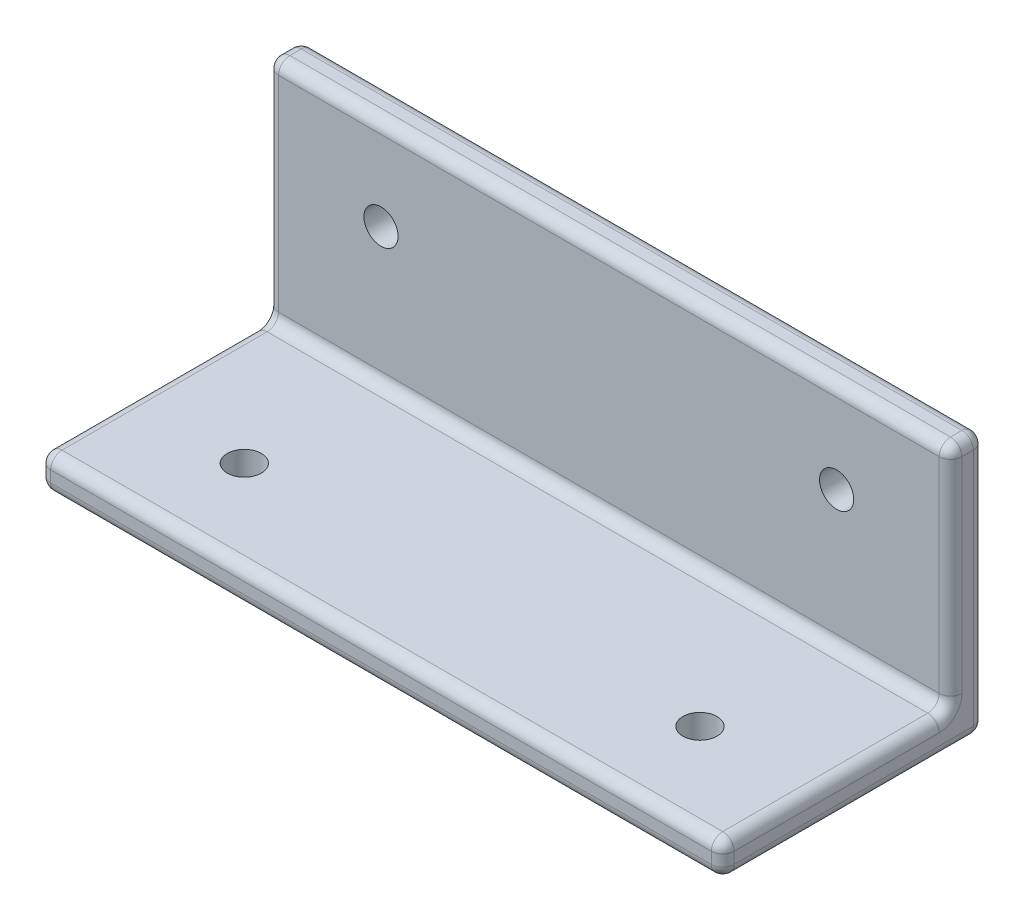
ISO-10303-21;
HEADER;
FILE_DESCRIPTION(('STEP AP214'),'2;1');
FILE_NAME('part.step','',(''),(''),'','','');
FILE_SCHEMA(('AUTOMOTIVE_DESIGN { 1 0 10303 214 1 1 1 1 }'));
ENDSEC;
DATA;
#1=APPLICATION_CONTEXT('core data for automotive mechanical design processes');
#2=APPLICATION_PROTOCOL_DEFINITION('international standard','automotive_design',2000,#1);
#3=PRODUCT_CONTEXT('',#1,'mechanical');
#4=PRODUCT('Part','Part','',(#3));
#5=PRODUCT_RELATED_PRODUCT_CATEGORY('part','',(#4));
#6=PRODUCT_DEFINITION_FORMATION('','',#4);
#7=PRODUCT_DEFINITION_CONTEXT('part definition',#1,'design');
#8=PRODUCT_DEFINITION('design','',#6,#7);
#9=PRODUCT_DEFINITION_SHAPE('','',#8);
#10=(LENGTH_UNIT() NAMED_UNIT(*) SI_UNIT(.MILLI.,.METRE.));
#11=(NAMED_UNIT(*) PLANE_ANGLE_UNIT() SI_UNIT($,.RADIAN.));
#12=(NAMED_UNIT(*) SI_UNIT($,.STERADIAN.) SOLID_ANGLE_UNIT());
#13=UNCERTAINTY_MEASURE_WITH_UNIT(LENGTH_MEASURE(1.E-05),#10,'distance_accuracy_value','');
#14=(GEOMETRIC_REPRESENTATION_CONTEXT(3) GLOBAL_UNCERTAINTY_ASSIGNED_CONTEXT((#13)) GLOBAL_UNIT_ASSIGNED_CONTEXT((#10,
#11,#12)) REPRESENTATION_CONTEXT('',''));
#15=CARTESIAN_POINT('',(0.,0.,0.));
#16=DIRECTION('',(0.,0.,1.));
#17=DIRECTION('',(1.,0.,0.));
#18=AXIS2_PLACEMENT_3D('',#15,#16,#17);
#19=CARTESIAN_POINT('',(-30.,23.,-10.));
#20=DIRECTION('',(0.,0.,-1.));
#21=DIRECTION('',(-1.,0.,0.));
#22=AXIS2_PLACEMENT_3D('',#19,#20,#21);
#23=PLANE('',#22);
#24=DIRECTION('',(1.,0.,0.));
#25=VECTOR('',#24,1.);
#26=CARTESIAN_POINT('',(-30.,22.,-10.));
#27=LINE('',#26,#25);
#28=CARTESIAN_POINT('',(29.,22.,-10.));
#29=VERTEX_POINT('',#28);
#30=CARTESIAN_POINT('',(-29.,22.,-10.));
#31=VERTEX_POINT('',#30);
#32=EDGE_CURVE('E285',#29,#31,#27,.F.);
#33=ORIENTED_EDGE('',*,*,#32,.T.);
#34=DIRECTION('',(0.,-1.,0.));
#35=VECTOR('',#34,1.);
#36=CARTESIAN_POINT('',(-29.,23.,-10.));
#37=LINE('',#36,#35);
#38=CARTESIAN_POINT('',(-29.,4.,-10.));
#39=VERTEX_POINT('',#38);
#40=EDGE_CURVE('E292',#31,#39,#37,.T.);
#41=ORIENTED_EDGE('',*,*,#40,.T.);
#42=DIRECTION('',(1.,0.,0.));
#43=VECTOR('',#42,1.);
#44=CARTESIAN_POINT('',(30.,4.,-10.));
#45=LINE('',#44,#43);
#46=CARTESIAN_POINT('',(29.,4.,-10.));
#47=VERTEX_POINT('',#46);
#48=EDGE_CURVE('E288',#39,#47,#45,.T.);
#49=ORIENTED_EDGE('',*,*,#48,.T.);
#50=DIRECTION('',(0.,-1.,0.));
#51=VECTOR('',#50,1.);
#52=CARTESIAN_POINT('',(29.,23.,-10.));
#53=LINE('',#52,#51);
#54=EDGE_CURVE('E282',#47,#29,#53,.F.);
#55=ORIENTED_EDGE('',*,*,#54,.T.);
#56=EDGE_LOOP('',(#33,#41,#49,#55));
#57=FACE_BOUND('',#56,.T.);
#58=CARTESIAN_POINT('',(20.,15.,-10.));
#59=DIRECTION('',(0.,0.,-1.));
#60=DIRECTION('',(-1.,0.,0.));
#61=AXIS2_PLACEMENT_3D('',#58,#59,#60);
#62=CIRCLE('',#61,1.5);
#63=CARTESIAN_POINT('',(18.5,15.,-10.));
#64=VERTEX_POINT('',#63);
#65=EDGE_CURVE('E879',#64,#64,#62,.T.);
#66=ORIENTED_EDGE('',*,*,#65,.T.);
#67=EDGE_LOOP('',(#66));
#68=FACE_BOUND('',#67,.T.);
#69=CARTESIAN_POINT('',(-20.,15.,-10.));
#70=DIRECTION('',(0.,0.,1.));
#71=DIRECTION('',(1.,0.,0.));
#72=AXIS2_PLACEMENT_3D('',#69,#70,#71);
#73=CIRCLE('',#72,1.5);
#74=CARTESIAN_POINT('',(-18.5,15.,-10.));
#75=VERTEX_POINT('',#74);
#76=EDGE_CURVE('E876',#75,#75,#73,.T.);
#77=ORIENTED_EDGE('',*,*,#76,.F.);
#78=EDGE_LOOP('',(#77));
#79=FACE_BOUND('',#78,.T.);
#80=ADVANCED_FACE('F45',(#57,#68,#79),#23,.F.);
#81=CARTESIAN_POINT('',(-30.,23.,-13.));
#82=DIRECTION('',(0.,0.,1.));
#83=DIRECTION('',(1.,0.,0.));
#84=AXIS2_PLACEMENT_3D('',#81,#82,#83);
#85=PLANE('',#84);
#86=DIRECTION('',(-1.,0.,0.));
#87=VECTOR('',#86,1.);
#88=CARTESIAN_POINT('',(-30.,1.,-13.));
#89=LINE('',#88,#87);
#90=CARTESIAN_POINT('',(29.,1.,-13.));
#91=VERTEX_POINT('',#90);
#92=CARTESIAN_POINT('',(-29.,1.,-13.));
#93=VERTEX_POINT('',#92);
#94=EDGE_CURVE('E249',#91,#93,#89,.T.);
#95=ORIENTED_EDGE('',*,*,#94,.T.);
#96=DIRECTION('',(0.,-1.,0.));
#97=VECTOR('',#96,1.);
#98=CARTESIAN_POINT('',(-29.,23.,-13.));
#99=LINE('',#98,#97);
#100=CARTESIAN_POINT('',(-29.,22.,-13.));
#101=VERTEX_POINT('',#100);
#102=EDGE_CURVE('E253',#93,#101,#99,.F.);
#103=ORIENTED_EDGE('',*,*,#102,.T.);
#104=DIRECTION('',(-1.,0.,0.));
#105=VECTOR('',#104,1.);
#106=CARTESIAN_POINT('',(30.,22.,-13.));
#107=LINE('',#106,#105);
#108=CARTESIAN_POINT('',(29.,22.,-13.));
#109=VERTEX_POINT('',#108);
#110=EDGE_CURVE('E246',#101,#109,#107,.F.);
#111=ORIENTED_EDGE('',*,*,#110,.T.);
#112=DIRECTION('',(0.,-1.,0.));
#113=VECTOR('',#112,1.);
#114=CARTESIAN_POINT('',(29.,0.,-13.));
#115=LINE('',#114,#113);
#116=EDGE_CURVE('E243',#109,#91,#115,.T.);
#117=ORIENTED_EDGE('',*,*,#116,.T.);
#118=EDGE_LOOP('',(#95,#103,#111,#117));
#119=FACE_BOUND('',#118,.T.);
#120=CARTESIAN_POINT('',(20.,15.,-13.));
#121=DIRECTION('',(0.,0.,-1.));
#122=DIRECTION('',(-1.,0.,0.));
#123=AXIS2_PLACEMENT_3D('',#120,#121,#122);
#124=CIRCLE('',#123,1.5);
#125=CARTESIAN_POINT('',(18.5,15.,-13.));
#126=VERTEX_POINT('',#125);
#127=EDGE_CURVE('E885',#126,#126,#124,.T.);
#128=ORIENTED_EDGE('',*,*,#127,.F.);
#129=EDGE_LOOP('',(#128));
#130=FACE_BOUND('',#129,.T.);
#131=CARTESIAN_POINT('',(-20.,15.,-13.));
#132=DIRECTION('',(0.,0.,1.));
#133=DIRECTION('',(1.,0.,0.));
#134=AXIS2_PLACEMENT_3D('',#131,#132,#133);
#135=CIRCLE('',#134,1.5);
#136=CARTESIAN_POINT('',(-18.5,15.,-13.));
#137=VERTEX_POINT('',#136);
#138=EDGE_CURVE('E873',#137,#137,#135,.T.);
#139=ORIENTED_EDGE('',*,*,#138,.T.);
#140=EDGE_LOOP('',(#139));
#141=FACE_BOUND('',#140,.T.);
#142=ADVANCED_FACE('F460',(#119,#130,#141),#85,.F.);
#143=CARTESIAN_POINT('',(0.,3.,0.));
#144=DIRECTION('',(0.,-1.,0.));
#145=DIRECTION('',(0.,0.,-1.));
#146=AXIS2_PLACEMENT_3D('',#143,#144,#145);
#147=PLANE('',#146);
#148=DIRECTION('',(1.,0.,0.));
#149=VECTOR('',#148,1.);
#150=CARTESIAN_POINT('',(0.,3.,9.00000000000001));
#151=LINE('',#150,#149);
#152=CARTESIAN_POINT('',(-29.,3.,9.00000000000001));
#153=VERTEX_POINT('',#152);
#154=CARTESIAN_POINT('',(29.,3.,9.00000000000001));
#155=VERTEX_POINT('',#154);
#156=EDGE_CURVE('E298',#153,#155,#151,.T.);
#157=ORIENTED_EDGE('',*,*,#156,.T.);
#158=DIRECTION('',(0.,0.,1.));
#159=VECTOR('',#158,1.);
#160=CARTESIAN_POINT('',(29.,3.,-10.));
#161=LINE('',#160,#159);
#162=CARTESIAN_POINT('',(29.,3.,-9.));
#163=VERTEX_POINT('',#162);
#164=EDGE_CURVE('E305',#155,#163,#161,.F.);
#165=ORIENTED_EDGE('',*,*,#164,.T.);
#166=DIRECTION('',(1.,0.,0.));
#167=VECTOR('',#166,1.);
#168=CARTESIAN_POINT('',(-30.,3.,-9.));
#169=LINE('',#168,#167);
#170=CARTESIAN_POINT('',(-29.,3.,-9.));
#171=VERTEX_POINT('',#170);
#172=EDGE_CURVE('E301',#163,#171,#169,.F.);
#173=ORIENTED_EDGE('',*,*,#172,.T.);
#174=DIRECTION('',(0.,0.,1.));
#175=VECTOR('',#174,1.);
#176=CARTESIAN_POINT('',(-29.,3.,0.));
#177=LINE('',#176,#175);
#178=EDGE_CURVE('E295',#171,#153,#177,.T.);
#179=ORIENTED_EDGE('',*,*,#178,.T.);
#180=EDGE_LOOP('',(#157,#165,#173,#179));
#181=FACE_BOUND('',#180,.T.);
#182=CARTESIAN_POINT('',(20.,3.,2.));
#183=DIRECTION('',(0.,-1.,0.));
#184=DIRECTION('',(0.,0.,-1.));
#185=AXIS2_PLACEMENT_3D('',#182,#183,#184);
#186=CIRCLE('',#185,1.5);
#187=CARTESIAN_POINT('',(20.,3.,0.500000000000002));
#188=VERTEX_POINT('',#187);
#189=EDGE_CURVE('E897',#188,#188,#186,.T.);
#190=ORIENTED_EDGE('',*,*,#189,.T.);
#191=EDGE_LOOP('',(#190));
#192=FACE_BOUND('',#191,.T.);
#193=CARTESIAN_POINT('',(-20.,3.,2.));
#194=DIRECTION('',(0.,1.,0.));
#195=DIRECTION('',(0.,0.,1.));
#196=AXIS2_PLACEMENT_3D('',#193,#194,#195);
#197=CIRCLE('',#196,1.5);
#198=CARTESIAN_POINT('',(-20.,3.,3.5));
#199=VERTEX_POINT('',#198);
#200=EDGE_CURVE('E894',#199,#199,#197,.T.);
#201=ORIENTED_EDGE('',*,*,#200,.F.);
#202=EDGE_LOOP('',(#201));
#203=FACE_BOUND('',#202,.T.);
#204=ADVANCED_FACE('F485',(#181,#192,#203),#147,.F.);
#205=CARTESIAN_POINT('',(0.,0.,0.));
#206=DIRECTION('',(0.,-1.,0.));
#207=DIRECTION('',(0.,0.,-1.));
#208=AXIS2_PLACEMENT_3D('',#205,#206,#207);
#209=PLANE('',#208);
#210=CARTESIAN_POINT('',(20.,0.,2.));
#211=DIRECTION('',(0.,-1.,0.));
#212=DIRECTION('',(0.,0.,-1.));
#213=AXIS2_PLACEMENT_3D('',#210,#211,#212);
#214=CIRCLE('',#213,1.5);
#215=CARTESIAN_POINT('',(20.,0.,0.500000000000002));
#216=VERTEX_POINT('',#215);
#217=EDGE_CURVE('E213',#216,#216,#214,.T.);
#218=ORIENTED_EDGE('',*,*,#217,.F.);
#219=EDGE_LOOP('',(#218));
#220=FACE_BOUND('',#219,.T.);
#221=DIRECTION('',(0.,0.,1.));
#222=VECTOR('',#221,1.);
#223=CARTESIAN_POINT('',(-29.,0.,-13.));
#224=LINE('',#223,#222);
#225=CARTESIAN_POINT('',(-29.,0.,9.00000000000001));
#226=VERTEX_POINT('',#225);
#227=CARTESIAN_POINT('',(-29.,0.,-12.));
#228=VERTEX_POINT('',#227);
#229=EDGE_CURVE('E262',#226,#228,#224,.F.);
#230=ORIENTED_EDGE('',*,*,#229,.T.);
#231=DIRECTION('',(-1.,0.,0.));
#232=VECTOR('',#231,1.);
#233=CARTESIAN_POINT('',(30.,0.,-12.));
#234=LINE('',#233,#232);
#235=CARTESIAN_POINT('',(29.,0.,-12.));
#236=VERTEX_POINT('',#235);
#237=EDGE_CURVE('E265',#228,#236,#234,.F.);
#238=ORIENTED_EDGE('',*,*,#237,.T.);
#239=DIRECTION('',(0.,0.,1.));
#240=VECTOR('',#239,1.);
#241=CARTESIAN_POINT('',(29.,0.,0.));
#242=LINE('',#241,#240);
#243=CARTESIAN_POINT('',(29.,0.,9.00000000000001));
#244=VERTEX_POINT('',#243);
#245=EDGE_CURVE('E256',#236,#244,#242,.T.);
#246=ORIENTED_EDGE('',*,*,#245,.T.);
#247=DIRECTION('',(1.,0.,0.));
#248=VECTOR('',#247,1.);
#249=CARTESIAN_POINT('',(-30.,0.,9.00000000000001));
#250=LINE('',#249,#248);
#251=EDGE_CURVE('E259',#244,#226,#250,.F.);
#252=ORIENTED_EDGE('',*,*,#251,.T.);
#253=EDGE_LOOP('',(#230,#238,#246,#252));
#254=FACE_BOUND('',#253,.T.);
#255=CARTESIAN_POINT('',(-20.,0.,2.));
#256=DIRECTION('',(0.,1.,0.));
#257=DIRECTION('',(0.,0.,1.));
#258=AXIS2_PLACEMENT_3D('',#255,#256,#257);
#259=CIRCLE('',#258,1.5);
#260=CARTESIAN_POINT('',(-20.,0.,3.5));
#261=VERTEX_POINT('',#260);
#262=EDGE_CURVE('E329',#261,#261,#259,.T.);
#263=ORIENTED_EDGE('',*,*,#262,.T.);
#264=EDGE_LOOP('',(#263));
#265=FACE_BOUND('',#264,.T.);
#266=ADVANCED_FACE('F494',(#220,#254,#265),#209,.T.);
#267=CARTESIAN_POINT('',(-30.,3.,-10.));
#268=DIRECTION('',(1.,0.,0.));
#269=DIRECTION('',(0.,0.,-1.));
#270=AXIS2_PLACEMENT_3D('',#267,#268,#269);
#271=PLANE('',#270);
#272=DIRECTION('',(0.,-1.,0.));
#273=VECTOR('',#272,1.);
#274=CARTESIAN_POINT('',(-30.,3.,-11.));
#275=LINE('',#274,#273);
#276=CARTESIAN_POINT('',(-30.,4.,-11.));
#277=VERTEX_POINT('',#276);
#278=CARTESIAN_POINT('',(-30.,22.,-11.));
#279=VERTEX_POINT('',#278);
#280=EDGE_CURVE('E69',#277,#279,#275,.F.);
#281=ORIENTED_EDGE('',*,*,#280,.T.);
#282=DIRECTION('',(0.,0.,1.));
#283=VECTOR('',#282,1.);
#284=CARTESIAN_POINT('',(-30.,22.,-13.));
#285=LINE('',#284,#283);
#286=CARTESIAN_POINT('',(-30.,22.,-12.));
#287=VERTEX_POINT('',#286);
#288=EDGE_CURVE('E11',#279,#287,#285,.F.);
#289=ORIENTED_EDGE('',*,*,#288,.T.);
#290=DIRECTION('',(0.,-1.,0.));
#291=VECTOR('',#290,1.);
#292=CARTESIAN_POINT('',(-30.,3.,-12.));
#293=LINE('',#292,#291);
#294=CARTESIAN_POINT('',(-30.,1.,-12.));
#295=VERTEX_POINT('',#294);
#296=EDGE_CURVE('E55',#287,#295,#293,.T.);
#297=ORIENTED_EDGE('',*,*,#296,.T.);
#298=DIRECTION('',(0.,0.,1.));
#299=VECTOR('',#298,1.);
#300=CARTESIAN_POINT('',(-30.,1.,10.));
#301=LINE('',#300,#299);
#302=CARTESIAN_POINT('',(-30.,1.,9.00000000000001));
#303=VERTEX_POINT('',#302);
#304=EDGE_CURVE('E318',#295,#303,#301,.T.);
#305=ORIENTED_EDGE('',*,*,#304,.T.);
#306=DIRECTION('',(0.,-1.,0.));
#307=VECTOR('',#306,1.);
#308=CARTESIAN_POINT('',(-30.,3.,9.00000000000001));
#309=LINE('',#308,#307);
#310=CARTESIAN_POINT('',(-30.,2.,9.00000000000001));
#311=VERTEX_POINT('',#310);
#312=EDGE_CURVE('E315',#303,#311,#309,.F.);
#313=ORIENTED_EDGE('',*,*,#312,.T.);
#314=DIRECTION('',(0.,0.,1.));
#315=VECTOR('',#314,1.);
#316=CARTESIAN_POINT('',(-30.,2.,-10.));
#317=LINE('',#316,#315);
#318=CARTESIAN_POINT('',(-30.,2.,-9.));
#319=VERTEX_POINT('',#318);
#320=EDGE_CURVE('E312',#311,#319,#317,.F.);
#321=ORIENTED_EDGE('',*,*,#320,.T.);
#322=CARTESIAN_POINT('',(-30.,4.,-9.));
#323=DIRECTION('',(1.,0.,0.));
#324=DIRECTION('',(0.,0.,-1.));
#325=AXIS2_PLACEMENT_3D('',#322,#323,#324);
#326=CIRCLE('',#325,2.);
#327=EDGE_CURVE('E308',#277,#319,#326,.F.);
#328=ORIENTED_EDGE('',*,*,#327,.F.);
#329=EDGE_LOOP('',(#281,#289,#297,#305,#313,#321,#328));
#330=FACE_BOUND('',#329,.T.);
#331=ADVANCED_FACE('F498',(#330),#271,.F.);
#332=CARTESIAN_POINT('',(-30.,3.,10.));
#333=DIRECTION('',(0.,0.,-1.));
#334=DIRECTION('',(-1.,0.,0.));
#335=AXIS2_PLACEMENT_3D('',#332,#333,#334);
#336=PLANE('',#335);
#337=DIRECTION('',(0.,-1.,0.));
#338=VECTOR('',#337,1.);
#339=CARTESIAN_POINT('',(29.,3.,10.));
#340=LINE('',#339,#338);
#341=CARTESIAN_POINT('',(29.,1.,10.));
#342=VERTEX_POINT('',#341);
#343=CARTESIAN_POINT('',(29.,2.,10.));
#344=VERTEX_POINT('',#343);
#345=EDGE_CURVE('E236',#342,#344,#340,.F.);
#346=ORIENTED_EDGE('',*,*,#345,.T.);
#347=DIRECTION('',(1.,0.,0.));
#348=VECTOR('',#347,1.);
#349=CARTESIAN_POINT('',(-30.,2.,10.));
#350=LINE('',#349,#348);
#351=CARTESIAN_POINT('',(-29.,2.,10.));
#352=VERTEX_POINT('',#351);
#353=EDGE_CURVE('E240',#344,#352,#350,.F.);
#354=ORIENTED_EDGE('',*,*,#353,.T.);
#355=DIRECTION('',(0.,-1.,0.));
#356=VECTOR('',#355,1.);
#357=CARTESIAN_POINT('',(-29.,3.,10.));
#358=LINE('',#357,#356);
#359=CARTESIAN_POINT('',(-29.,1.,10.));
#360=VERTEX_POINT('',#359);
#361=EDGE_CURVE('E233',#352,#360,#358,.T.);
#362=ORIENTED_EDGE('',*,*,#361,.T.);
#363=DIRECTION('',(1.,0.,0.));
#364=VECTOR('',#363,1.);
#365=CARTESIAN_POINT('',(30.,1.,10.));
#366=LINE('',#365,#364);
#367=EDGE_CURVE('E230',#360,#342,#366,.T.);
#368=ORIENTED_EDGE('',*,*,#367,.T.);
#369=EDGE_LOOP('',(#346,#354,#362,#368));
#370=FACE_BOUND('',#369,.T.);
#371=ADVANCED_FACE('F502',(#370),#336,.F.);
#372=CARTESIAN_POINT('',(30.,3.,-10.));
#373=DIRECTION('',(1.,0.,0.));
#374=DIRECTION('',(0.,0.,-1.));
#375=AXIS2_PLACEMENT_3D('',#372,#373,#374);
#376=PLANE('',#375);
#377=DIRECTION('',(0.,-1.,0.));
#378=VECTOR('',#377,1.);
#379=CARTESIAN_POINT('',(30.,0.,9.00000000000001));
#380=LINE('',#379,#378);
#381=CARTESIAN_POINT('',(30.,2.,9.00000000000001));
#382=VERTEX_POINT('',#381);
#383=CARTESIAN_POINT('',(30.,1.,9.00000000000001));
#384=VERTEX_POINT('',#383);
#385=EDGE_CURVE('E221',#382,#384,#380,.T.);
#386=ORIENTED_EDGE('',*,*,#385,.T.);
#387=DIRECTION('',(0.,0.,1.));
#388=VECTOR('',#387,1.);
#389=CARTESIAN_POINT('',(30.,1.,-10.));
#390=LINE('',#389,#388);
#391=CARTESIAN_POINT('',(30.,1.,-12.));
#392=VERTEX_POINT('',#391);
#393=EDGE_CURVE('E227',#384,#392,#390,.F.);
#394=ORIENTED_EDGE('',*,*,#393,.T.);
#395=DIRECTION('',(0.,-1.,0.));
#396=VECTOR('',#395,1.);
#397=CARTESIAN_POINT('',(30.,23.,-12.));
#398=LINE('',#397,#396);
#399=CARTESIAN_POINT('',(30.,22.,-12.));
#400=VERTEX_POINT('',#399);
#401=EDGE_CURVE('E224',#392,#400,#398,.F.);
#402=ORIENTED_EDGE('',*,*,#401,.T.);
#403=DIRECTION('',(0.,0.,-1.));
#404=VECTOR('',#403,1.);
#405=CARTESIAN_POINT('',(30.,22.,-10.));
#406=LINE('',#405,#404);
#407=CARTESIAN_POINT('',(30.,22.,-11.));
#408=VERTEX_POINT('',#407);
#409=EDGE_CURVE('E218',#400,#408,#406,.F.);
#410=ORIENTED_EDGE('',*,*,#409,.T.);
#411=DIRECTION('',(0.,-1.,0.));
#412=VECTOR('',#411,1.);
#413=CARTESIAN_POINT('',(30.,3.,-11.));
#414=LINE('',#413,#412);
#415=CARTESIAN_POINT('',(30.,4.,-11.));
#416=VERTEX_POINT('',#415);
#417=EDGE_CURVE('E186',#408,#416,#414,.T.);
#418=ORIENTED_EDGE('',*,*,#417,.T.);
#419=CARTESIAN_POINT('',(30.,4.,-9.));
#420=DIRECTION('',(1.,0.,0.));
#421=DIRECTION('',(0.,0.,-1.));
#422=AXIS2_PLACEMENT_3D('',#419,#420,#421);
#423=CIRCLE('',#422,2.);
#424=CARTESIAN_POINT('',(30.,2.,-9.));
#425=VERTEX_POINT('',#424);
#426=EDGE_CURVE('E178',#425,#416,#423,.T.);
#427=ORIENTED_EDGE('',*,*,#426,.F.);
#428=DIRECTION('',(0.,0.,1.));
#429=VECTOR('',#428,1.);
#430=CARTESIAN_POINT('',(30.,2.,10.));
#431=LINE('',#430,#429);
#432=EDGE_CURVE('E183',#425,#382,#431,.T.);
#433=ORIENTED_EDGE('',*,*,#432,.T.);
#434=EDGE_LOOP('',(#386,#394,#402,#410,#418,#427,#433));
#435=FACE_BOUND('',#434,.T.);
#436=ADVANCED_FACE('F181',(#435),#376,.T.);
#437=CARTESIAN_POINT('',(0.,23.,0.));
#438=DIRECTION('',(0.,1.,0.));
#439=DIRECTION('',(0.,0.,1.));
#440=AXIS2_PLACEMENT_3D('',#437,#438,#439);
#441=PLANE('',#440);
#442=DIRECTION('',(0.,0.,1.));
#443=VECTOR('',#442,1.);
#444=CARTESIAN_POINT('',(-29.,23.,-10.));
#445=LINE('',#444,#443);
#446=CARTESIAN_POINT('',(-29.,23.,-12.));
#447=VERTEX_POINT('',#446);
#448=CARTESIAN_POINT('',(-29.,23.,-11.));
#449=VERTEX_POINT('',#448);
#450=EDGE_CURVE('E272',#447,#449,#445,.T.);
#451=ORIENTED_EDGE('',*,*,#450,.T.);
#452=DIRECTION('',(1.,0.,0.));
#453=VECTOR('',#452,1.);
#454=CARTESIAN_POINT('',(30.,23.,-11.));
#455=LINE('',#454,#453);
#456=CARTESIAN_POINT('',(29.,23.,-11.));
#457=VERTEX_POINT('',#456);
#458=EDGE_CURVE('E279',#449,#457,#455,.T.);
#459=ORIENTED_EDGE('',*,*,#458,.T.);
#460=DIRECTION('',(0.,0.,-1.));
#461=VECTOR('',#460,1.);
#462=CARTESIAN_POINT('',(29.,23.,0.));
#463=LINE('',#462,#461);
#464=CARTESIAN_POINT('',(29.,23.,-12.));
#465=VERTEX_POINT('',#464);
#466=EDGE_CURVE('E275',#457,#465,#463,.T.);
#467=ORIENTED_EDGE('',*,*,#466,.T.);
#468=DIRECTION('',(-1.,0.,0.));
#469=VECTOR('',#468,1.);
#470=CARTESIAN_POINT('',(-30.,23.,-12.));
#471=LINE('',#470,#469);
#472=EDGE_CURVE('E269',#465,#447,#471,.T.);
#473=ORIENTED_EDGE('',*,*,#472,.T.);
#474=EDGE_LOOP('',(#451,#459,#467,#473));
#475=FACE_BOUND('',#474,.T.);
#476=ADVANCED_FACE('F489',(#475),#441,.T.);
#477=CARTESIAN_POINT('',(-29.,22.,0.));
#478=DIRECTION('',(0.,0.,-1.));
#479=DIRECTION('',(-1.,0.,0.));
#480=AXIS2_PLACEMENT_3D('',#477,#478,#479);
#481=CYLINDRICAL_SURFACE('',#480,1.);
#482=CARTESIAN_POINT('',(-29.,22.,-11.));
#483=DIRECTION('',(0.,0.,1.));
#484=DIRECTION('',(1.,0.,0.));
#485=AXIS2_PLACEMENT_3D('',#482,#483,#484);
#486=CIRCLE('',#485,1.);
#487=EDGE_CURVE('E49',#449,#279,#486,.T.);
#488=ORIENTED_EDGE('',*,*,#487,.F.);
#489=ORIENTED_EDGE('',*,*,#450,.F.);
#490=CARTESIAN_POINT('',(-29.,22.,-12.));
#491=DIRECTION('',(0.,0.,-1.));
#492=DIRECTION('',(-1.,0.,0.));
#493=AXIS2_PLACEMENT_3D('',#490,#491,#492);
#494=CIRCLE('',#493,1.);
#495=EDGE_CURVE('E211',#287,#447,#494,.T.);
#496=ORIENTED_EDGE('',*,*,#495,.F.);
#497=ORIENTED_EDGE('',*,*,#288,.F.);
#498=EDGE_LOOP('',(#488,#489,#496,#497));
#499=FACE_BOUND('',#498,.T.);
#500=ADVANCED_FACE('F47',(#499),#481,.T.);
#501=CARTESIAN_POINT('',(-29.,22.,-11.));
#502=DIRECTION('',(-1.,0.,0.));
#503=DIRECTION('',(0.,0.,1.));
#504=AXIS2_PLACEMENT_3D('',#501,#502,#503);
#505=SPHERICAL_SURFACE('',#504,1.);
#506=CARTESIAN_POINT('',(-29.,22.,-11.));
#507=DIRECTION('',(-1.,0.,0.));
#508=DIRECTION('',(0.,0.,1.));
#509=AXIS2_PLACEMENT_3D('',#506,#507,#508);
#510=CIRCLE('',#509,1.);
#511=EDGE_CURVE('E438',#449,#31,#510,.F.);
#512=ORIENTED_EDGE('',*,*,#511,.F.);
#513=ORIENTED_EDGE('',*,*,#487,.T.);
#514=CARTESIAN_POINT('',(-29.,22.,-11.));
#515=DIRECTION('',(0.,1.,0.));
#516=DIRECTION('',(0.,0.,1.));
#517=AXIS2_PLACEMENT_3D('',#514,#515,#516);
#518=CIRCLE('',#517,1.);
#519=EDGE_CURVE('E442',#31,#279,#518,.F.);
#520=ORIENTED_EDGE('',*,*,#519,.F.);
#521=EDGE_LOOP('',(#512,#513,#520));
#522=FACE_BOUND('',#521,.T.);
#523=ADVANCED_FACE('F645',(#522),#505,.T.);
#524=CARTESIAN_POINT('',(-29.,22.,-12.));
#525=DIRECTION('',(0.,1.,0.));
#526=DIRECTION('',(0.,0.,1.));
#527=AXIS2_PLACEMENT_3D('',#524,#525,#526);
#528=SPHERICAL_SURFACE('',#527,1.);
#529=CARTESIAN_POINT('',(-29.,22.,-12.));
#530=DIRECTION('',(0.,1.,0.));
#531=DIRECTION('',(0.,0.,1.));
#532=AXIS2_PLACEMENT_3D('',#529,#530,#531);
#533=CIRCLE('',#532,1.);
#534=EDGE_CURVE('E431',#287,#101,#533,.F.);
#535=ORIENTED_EDGE('',*,*,#534,.F.);
#536=ORIENTED_EDGE('',*,*,#495,.T.);
#537=CARTESIAN_POINT('',(-29.,22.,-12.));
#538=DIRECTION('',(-1.,0.,0.));
#539=DIRECTION('',(0.,0.,1.));
#540=AXIS2_PLACEMENT_3D('',#537,#538,#539);
#541=CIRCLE('',#540,1.);
#542=EDGE_CURVE('E434',#101,#447,#541,.F.);
#543=ORIENTED_EDGE('',*,*,#542,.F.);
#544=EDGE_LOOP('',(#535,#536,#543));
#545=FACE_BOUND('',#544,.T.);
#546=ADVANCED_FACE('F450',(#545),#528,.T.);
#547=CARTESIAN_POINT('',(-29.,23.,-11.));
#548=DIRECTION('',(0.,-1.,0.));
#549=DIRECTION('',(0.,0.,-1.));
#550=AXIS2_PLACEMENT_3D('',#547,#548,#549);
#551=CYLINDRICAL_SURFACE('',#550,1.);
#552=ORIENTED_EDGE('',*,*,#519,.T.);
#553=ORIENTED_EDGE('',*,*,#280,.F.);
#554=CARTESIAN_POINT('',(-29.,4.,-11.));
#555=DIRECTION('',(0.,-1.,0.));
#556=DIRECTION('',(0.,0.,-1.));
#557=AXIS2_PLACEMENT_3D('',#554,#555,#556);
#558=CIRCLE('',#557,1.);
#559=EDGE_CURVE('E427',#39,#277,#558,.T.);
#560=ORIENTED_EDGE('',*,*,#559,.F.);
#561=ORIENTED_EDGE('',*,*,#40,.F.);
#562=EDGE_LOOP('',(#552,#553,#560,#561));
#563=FACE_BOUND('',#562,.T.);
#564=ADVANCED_FACE('F643',(#563),#551,.T.);
#565=CARTESIAN_POINT('',(0.,22.,-11.));
#566=DIRECTION('',(-1.,0.,0.));
#567=DIRECTION('',(0.,0.,1.));
#568=AXIS2_PLACEMENT_3D('',#565,#566,#567);
#569=CYLINDRICAL_SURFACE('',#568,1.);
#570=ORIENTED_EDGE('',*,*,#511,.T.);
#571=ORIENTED_EDGE('',*,*,#32,.F.);
#572=CARTESIAN_POINT('',(29.,22.,-11.));
#573=DIRECTION('',(1.,0.,0.));
#574=DIRECTION('',(0.,0.,-1.));
#575=AXIS2_PLACEMENT_3D('',#572,#573,#574);
#576=CIRCLE('',#575,1.);
#577=EDGE_CURVE('E423',#457,#29,#576,.T.);
#578=ORIENTED_EDGE('',*,*,#577,.F.);
#579=ORIENTED_EDGE('',*,*,#458,.F.);
#580=EDGE_LOOP('',(#570,#571,#578,#579));
#581=FACE_BOUND('',#580,.T.);
#582=ADVANCED_FACE('F600',(#581),#569,.T.);
#583=CARTESIAN_POINT('',(29.,22.,0.));
#584=DIRECTION('',(0.,0.,-1.));
#585=DIRECTION('',(-1.,0.,0.));
#586=AXIS2_PLACEMENT_3D('',#583,#584,#585);
#587=CYLINDRICAL_SURFACE('',#586,1.);
#588=CARTESIAN_POINT('',(29.,22.,-12.));
#589=DIRECTION('',(0.,0.,-1.));
#590=DIRECTION('',(-1.,0.,0.));
#591=AXIS2_PLACEMENT_3D('',#588,#589,#590);
#592=CIRCLE('',#591,1.);
#593=EDGE_CURVE('E415',#465,#400,#592,.T.);
#594=ORIENTED_EDGE('',*,*,#593,.F.);
#595=ORIENTED_EDGE('',*,*,#466,.F.);
#596=CARTESIAN_POINT('',(29.,22.,-11.));
#597=DIRECTION('',(0.,0.,1.));
#598=DIRECTION('',(1.,0.,0.));
#599=AXIS2_PLACEMENT_3D('',#596,#597,#598);
#600=CIRCLE('',#599,1.);
#601=EDGE_CURVE('E419',#408,#457,#600,.T.);
#602=ORIENTED_EDGE('',*,*,#601,.F.);
#603=ORIENTED_EDGE('',*,*,#409,.F.);
#604=EDGE_LOOP('',(#594,#595,#602,#603));
#605=FACE_BOUND('',#604,.T.);
#606=ADVANCED_FACE('F476',(#605),#587,.T.);
#607=CARTESIAN_POINT('',(0.,22.,-12.));
#608=DIRECTION('',(1.,0.,0.));
#609=DIRECTION('',(0.,0.,-1.));
#610=AXIS2_PLACEMENT_3D('',#607,#608,#609);
#611=CYLINDRICAL_SURFACE('',#610,1.);
#612=ORIENTED_EDGE('',*,*,#542,.T.);
#613=ORIENTED_EDGE('',*,*,#472,.F.);
#614=CARTESIAN_POINT('',(29.,22.,-12.));
#615=DIRECTION('',(1.,0.,0.));
#616=DIRECTION('',(0.,1.,0.));
#617=AXIS2_PLACEMENT_3D('',#614,#615,#616);
#618=CIRCLE('',#617,1.);
#619=EDGE_CURVE('E412',#109,#465,#618,.T.);
#620=ORIENTED_EDGE('',*,*,#619,.F.);
#621=ORIENTED_EDGE('',*,*,#110,.F.);
#622=EDGE_LOOP('',(#612,#613,#620,#621));
#623=FACE_BOUND('',#622,.T.);
#624=ADVANCED_FACE('F456',(#623),#611,.T.);
#625=CARTESIAN_POINT('',(-29.,3.,-12.));
#626=DIRECTION('',(0.,-1.,0.));
#627=DIRECTION('',(0.,0.,-1.));
#628=AXIS2_PLACEMENT_3D('',#625,#626,#627);
#629=CYLINDRICAL_SURFACE('',#628,1.);
#630=ORIENTED_EDGE('',*,*,#534,.T.);
#631=ORIENTED_EDGE('',*,*,#102,.F.);
#632=CARTESIAN_POINT('',(-29.,1.,-12.));
#633=DIRECTION('',(0.,-1.,0.));
#634=DIRECTION('',(0.,0.,-1.));
#635=AXIS2_PLACEMENT_3D('',#632,#633,#634);
#636=CIRCLE('',#635,1.);
#637=EDGE_CURVE('E408',#295,#93,#636,.T.);
#638=ORIENTED_EDGE('',*,*,#637,.F.);
#639=ORIENTED_EDGE('',*,*,#296,.F.);
#640=EDGE_LOOP('',(#630,#631,#638,#639));
#641=FACE_BOUND('',#640,.T.);
#642=ADVANCED_FACE('F465',(#641),#629,.T.);
#643=CARTESIAN_POINT('',(-29.,4.,-9.));
#644=DIRECTION('',(1.,0.,0.));
#645=DIRECTION('',(0.,0.,-1.));
#646=AXIS2_PLACEMENT_3D('',#643,#644,#645);
#647=TOROIDAL_SURFACE('',#646,2.,1.);
#648=ORIENTED_EDGE('',*,*,#559,.T.);
#649=ORIENTED_EDGE('',*,*,#327,.T.);
#650=CARTESIAN_POINT('',(-29.,2.,-9.));
#651=DIRECTION('',(0.,0.,-1.));
#652=DIRECTION('',(-1.,0.,0.));
#653=AXIS2_PLACEMENT_3D('',#650,#651,#652);
#654=CIRCLE('',#653,1.);
#655=EDGE_CURVE('E404',#171,#319,#654,.F.);
#656=ORIENTED_EDGE('',*,*,#655,.F.);
#657=CARTESIAN_POINT('',(-29.,4.,-9.));
#658=DIRECTION('',(1.,0.,0.));
#659=DIRECTION('',(0.,0.,-1.));
#660=AXIS2_PLACEMENT_3D('',#657,#658,#659);
#661=CIRCLE('',#660,1.);
#662=EDGE_CURVE('E400',#39,#171,#661,.F.);
#663=ORIENTED_EDGE('',*,*,#662,.F.);
#664=EDGE_LOOP('',(#648,#649,#656,#663));
#665=FACE_BOUND('',#664,.T.);
#666=ADVANCED_FACE('F467',(#665),#647,.T.);
#667=CARTESIAN_POINT('',(29.,22.,-11.));
#668=DIRECTION('',(0.,1.,0.));
#669=DIRECTION('',(0.,0.,1.));
#670=AXIS2_PLACEMENT_3D('',#667,#668,#669);
#671=SPHERICAL_SURFACE('',#670,1.);
#672=ORIENTED_EDGE('',*,*,#601,.T.);
#673=ORIENTED_EDGE('',*,*,#577,.T.);
#674=CARTESIAN_POINT('',(29.,22.,-11.));
#675=DIRECTION('',(0.,1.,0.));
#676=DIRECTION('',(0.,0.,1.));
#677=AXIS2_PLACEMENT_3D('',#674,#675,#676);
#678=CIRCLE('',#677,1.);
#679=EDGE_CURVE('E396',#408,#29,#678,.F.);
#680=ORIENTED_EDGE('',*,*,#679,.F.);
#681=EDGE_LOOP('',(#672,#673,#680));
#682=FACE_BOUND('',#681,.T.);
#683=ADVANCED_FACE('F473',(#682),#671,.T.);
#684=CARTESIAN_POINT('',(29.,22.,-12.));
#685=DIRECTION('',(0.,1.,0.));
#686=DIRECTION('',(0.,0.,1.));
#687=AXIS2_PLACEMENT_3D('',#684,#685,#686);
#688=SPHERICAL_SURFACE('',#687,1.);
#689=ORIENTED_EDGE('',*,*,#619,.T.);
#690=ORIENTED_EDGE('',*,*,#593,.T.);
#691=CARTESIAN_POINT('',(29.,22.,-12.));
#692=DIRECTION('',(0.,1.,0.));
#693=DIRECTION('',(0.,0.,1.));
#694=AXIS2_PLACEMENT_3D('',#691,#692,#693);
#695=CIRCLE('',#694,1.);
#696=EDGE_CURVE('E392',#109,#400,#695,.F.);
#697=ORIENTED_EDGE('',*,*,#696,.F.);
#698=EDGE_LOOP('',(#689,#690,#697));
#699=FACE_BOUND('',#698,.T.);
#700=ADVANCED_FACE('F580',(#699),#688,.T.);
#701=CARTESIAN_POINT('',(-29.,1.,-12.));
#702=DIRECTION('',(0.,0.,-1.));
#703=DIRECTION('',(0.,1.,0.));
#704=AXIS2_PLACEMENT_3D('',#701,#702,#703);
#705=SPHERICAL_SURFACE('',#704,1.);
#706=CARTESIAN_POINT('',(-29.,1.,-12.));
#707=DIRECTION('',(0.,0.,-1.));
#708=DIRECTION('',(-1.,0.,0.));
#709=AXIS2_PLACEMENT_3D('',#706,#707,#708);
#710=CIRCLE('',#709,1.);
#711=EDGE_CURVE('E385',#295,#228,#710,.F.);
#712=ORIENTED_EDGE('',*,*,#711,.F.);
#713=ORIENTED_EDGE('',*,*,#637,.T.);
#714=CARTESIAN_POINT('',(-29.,1.,-12.));
#715=DIRECTION('',(-1.,0.,0.));
#716=DIRECTION('',(0.,0.,1.));
#717=AXIS2_PLACEMENT_3D('',#714,#715,#716);
#718=CIRCLE('',#717,1.);
#719=EDGE_CURVE('E389',#228,#93,#718,.F.);
#720=ORIENTED_EDGE('',*,*,#719,.F.);
#721=EDGE_LOOP('',(#712,#713,#720));
#722=FACE_BOUND('',#721,.T.);
#723=ADVANCED_FACE('F576',(#722),#705,.T.);
#724=CARTESIAN_POINT('',(-29.,2.,0.));
#725=DIRECTION('',(0.,0.,1.));
#726=DIRECTION('',(1.,0.,0.));
#727=AXIS2_PLACEMENT_3D('',#724,#725,#726);
#728=CYLINDRICAL_SURFACE('',#727,1.);
#729=ORIENTED_EDGE('',*,*,#655,.T.);
#730=ORIENTED_EDGE('',*,*,#320,.F.);
#731=CARTESIAN_POINT('',(-29.,2.,9.00000000000001));
#732=DIRECTION('',(0.,0.,1.));
#733=DIRECTION('',(1.,0.,0.));
#734=AXIS2_PLACEMENT_3D('',#731,#732,#733);
#735=CIRCLE('',#734,1.);
#736=EDGE_CURVE('E377',#153,#311,#735,.T.);
#737=ORIENTED_EDGE('',*,*,#736,.F.);
#738=ORIENTED_EDGE('',*,*,#178,.F.);
#739=EDGE_LOOP('',(#729,#730,#737,#738));
#740=FACE_BOUND('',#739,.T.);
#741=ADVANCED_FACE('F572',(#740),#728,.T.);
#742=CARTESIAN_POINT('',(-30.,4.,-9.));
#743=DIRECTION('',(-1.,0.,0.));
#744=DIRECTION('',(0.,0.,1.));
#745=AXIS2_PLACEMENT_3D('',#742,#743,#744);
#746=CYLINDRICAL_SURFACE('',#745,1.);
#747=ORIENTED_EDGE('',*,*,#662,.T.);
#748=ORIENTED_EDGE('',*,*,#172,.F.);
#749=CARTESIAN_POINT('',(29.,4.,-9.));
#750=DIRECTION('',(1.,0.,0.));
#751=DIRECTION('',(0.,0.,-1.));
#752=AXIS2_PLACEMENT_3D('',#749,#750,#751);
#753=CIRCLE('',#752,1.);
#754=EDGE_CURVE('E196',#47,#163,#753,.F.);
#755=ORIENTED_EDGE('',*,*,#754,.F.);
#756=ORIENTED_EDGE('',*,*,#48,.F.);
#757=EDGE_LOOP('',(#747,#748,#755,#756));
#758=FACE_BOUND('',#757,.T.);
#759=ADVANCED_FACE('F568',(#758),#746,.F.);
#760=CARTESIAN_POINT('',(29.,3.,-11.));
#761=DIRECTION('',(0.,1.,0.));
#762=DIRECTION('',(0.,0.,1.));
#763=AXIS2_PLACEMENT_3D('',#760,#761,#762);
#764=CYLINDRICAL_SURFACE('',#763,1.);
#765=ORIENTED_EDGE('',*,*,#679,.T.);
#766=ORIENTED_EDGE('',*,*,#54,.F.);
#767=CARTESIAN_POINT('',(29.,4.,-11.));
#768=DIRECTION('',(0.,-1.,0.));
#769=DIRECTION('',(0.,0.,-1.));
#770=AXIS2_PLACEMENT_3D('',#767,#768,#769);
#771=CIRCLE('',#770,1.);
#772=EDGE_CURVE('E372',#416,#47,#771,.T.);
#773=ORIENTED_EDGE('',*,*,#772,.F.);
#774=ORIENTED_EDGE('',*,*,#417,.F.);
#775=EDGE_LOOP('',(#765,#766,#773,#774));
#776=FACE_BOUND('',#775,.T.);
#777=ADVANCED_FACE('F564',(#776),#764,.T.);
#778=CARTESIAN_POINT('',(29.,23.,-12.));
#779=DIRECTION('',(0.,1.,0.));
#780=DIRECTION('',(0.,0.,1.));
#781=AXIS2_PLACEMENT_3D('',#778,#779,#780);
#782=CYLINDRICAL_SURFACE('',#781,1.);
#783=ORIENTED_EDGE('',*,*,#696,.T.);
#784=ORIENTED_EDGE('',*,*,#401,.F.);
#785=CARTESIAN_POINT('',(29.,1.,-12.));
#786=DIRECTION('',(0.,-1.,0.));
#787=DIRECTION('',(1.,0.,0.));
#788=AXIS2_PLACEMENT_3D('',#785,#786,#787);
#789=CIRCLE('',#788,1.);
#790=EDGE_CURVE('E368',#91,#392,#789,.T.);
#791=ORIENTED_EDGE('',*,*,#790,.F.);
#792=ORIENTED_EDGE('',*,*,#116,.F.);
#793=EDGE_LOOP('',(#783,#784,#791,#792));
#794=FACE_BOUND('',#793,.T.);
#795=ADVANCED_FACE('F560',(#794),#782,.T.);
#796=CARTESIAN_POINT('',(-30.,1.,-12.));
#797=DIRECTION('',(1.,0.,0.));
#798=DIRECTION('',(0.,0.,-1.));
#799=AXIS2_PLACEMENT_3D('',#796,#797,#798);
#800=CYLINDRICAL_SURFACE('',#799,1.);
#801=ORIENTED_EDGE('',*,*,#719,.T.);
#802=ORIENTED_EDGE('',*,*,#94,.F.);
#803=CARTESIAN_POINT('',(29.,1.,-12.));
#804=DIRECTION('',(1.,0.,0.));
#805=DIRECTION('',(0.,0.,-1.));
#806=AXIS2_PLACEMENT_3D('',#803,#804,#805);
#807=CIRCLE('',#806,1.);
#808=EDGE_CURVE('E364',#236,#91,#807,.T.);
#809=ORIENTED_EDGE('',*,*,#808,.F.);
#810=ORIENTED_EDGE('',*,*,#237,.F.);
#811=EDGE_LOOP('',(#801,#802,#809,#810));
#812=FACE_BOUND('',#811,.T.);
#813=ADVANCED_FACE('F556',(#812),#800,.T.);
#814=CARTESIAN_POINT('',(-29.,1.,-10.));
#815=DIRECTION('',(0.,0.,-1.));
#816=DIRECTION('',(-1.,0.,0.));
#817=AXIS2_PLACEMENT_3D('',#814,#815,#816);
#818=CYLINDRICAL_SURFACE('',#817,1.);
#819=ORIENTED_EDGE('',*,*,#711,.T.);
#820=ORIENTED_EDGE('',*,*,#229,.F.);
#821=CARTESIAN_POINT('',(-29.,1.,9.00000000000001));
#822=DIRECTION('',(0.,0.,1.));
#823=DIRECTION('',(1.,0.,0.));
#824=AXIS2_PLACEMENT_3D('',#821,#822,#823);
#825=CIRCLE('',#824,1.);
#826=EDGE_CURVE('E360',#303,#226,#825,.T.);
#827=ORIENTED_EDGE('',*,*,#826,.F.);
#828=ORIENTED_EDGE('',*,*,#304,.F.);
#829=EDGE_LOOP('',(#819,#820,#827,#828));
#830=FACE_BOUND('',#829,.T.);
#831=ADVANCED_FACE('F552',(#830),#818,.T.);
#832=CARTESIAN_POINT('',(-29.,3.,9.00000000000001));
#833=DIRECTION('',(0.,-1.,0.));
#834=DIRECTION('',(0.,0.,-1.));
#835=AXIS2_PLACEMENT_3D('',#832,#833,#834);
#836=CYLINDRICAL_SURFACE('',#835,1.);
#837=CARTESIAN_POINT('',(-29.,2.,9.00000000000001));
#838=DIRECTION('',(0.,1.,0.));
#839=DIRECTION('',(0.,0.,1.));
#840=AXIS2_PLACEMENT_3D('',#837,#838,#839);
#841=CIRCLE('',#840,1.);
#842=EDGE_CURVE('E381',#311,#352,#841,.T.);
#843=ORIENTED_EDGE('',*,*,#842,.F.);
#844=ORIENTED_EDGE('',*,*,#312,.F.);
#845=CARTESIAN_POINT('',(-29.,1.,9.00000000000001));
#846=DIRECTION('',(0.,-1.,0.));
#847=DIRECTION('',(0.,0.,-1.));
#848=AXIS2_PLACEMENT_3D('',#845,#846,#847);
#849=CIRCLE('',#848,1.);
#850=EDGE_CURVE('E356',#360,#303,#849,.T.);
#851=ORIENTED_EDGE('',*,*,#850,.F.);
#852=ORIENTED_EDGE('',*,*,#361,.F.);
#853=EDGE_LOOP('',(#843,#844,#851,#852));
#854=FACE_BOUND('',#853,.T.);
#855=ADVANCED_FACE('F548',(#854),#836,.T.);
#856=CARTESIAN_POINT('',(-29.,2.,9.00000000000001));
#857=DIRECTION('',(-1.,0.,0.));
#858=DIRECTION('',(0.,0.,1.));
#859=AXIS2_PLACEMENT_3D('',#856,#857,#858);
#860=SPHERICAL_SURFACE('',#859,1.);
#861=ORIENTED_EDGE('',*,*,#736,.T.);
#862=ORIENTED_EDGE('',*,*,#842,.T.);
#863=CARTESIAN_POINT('',(-29.,2.,9.00000000000001));
#864=DIRECTION('',(-1.,0.,0.));
#865=DIRECTION('',(0.,0.,1.));
#866=AXIS2_PLACEMENT_3D('',#863,#864,#865);
#867=CIRCLE('',#866,1.);
#868=EDGE_CURVE('E200',#153,#352,#867,.F.);
#869=ORIENTED_EDGE('',*,*,#868,.F.);
#870=EDGE_LOOP('',(#861,#862,#869));
#871=FACE_BOUND('',#870,.T.);
#872=ADVANCED_FACE('F545',(#871),#860,.T.);
#873=CARTESIAN_POINT('',(29.,4.,-9.));
#874=DIRECTION('',(1.,0.,0.));
#875=DIRECTION('',(0.,0.,-1.));
#876=AXIS2_PLACEMENT_3D('',#873,#874,#875);
#877=TOROIDAL_SURFACE('',#876,2.,1.);
#878=ORIENTED_EDGE('',*,*,#772,.T.);
#879=ORIENTED_EDGE('',*,*,#754,.T.);
#880=CARTESIAN_POINT('',(29.,2.,-9.));
#881=DIRECTION('',(0.,0.,-1.));
#882=DIRECTION('',(-1.,0.,0.));
#883=AXIS2_PLACEMENT_3D('',#880,#881,#882);
#884=CIRCLE('',#883,1.);
#885=EDGE_CURVE('E193',#425,#163,#884,.F.);
#886=ORIENTED_EDGE('',*,*,#885,.F.);
#887=ORIENTED_EDGE('',*,*,#426,.T.);
#888=EDGE_LOOP('',(#878,#879,#886,#887));
#889=FACE_BOUND('',#888,.T.);
#890=ADVANCED_FACE('F194',(#889),#877,.T.);
#891=CARTESIAN_POINT('',(29.,1.,-12.));
#892=DIRECTION('',(0.,0.,-1.));
#893=DIRECTION('',(-1.,0.,0.));
#894=AXIS2_PLACEMENT_3D('',#891,#892,#893);
#895=SPHERICAL_SURFACE('',#894,1.);
#896=ORIENTED_EDGE('',*,*,#808,.T.);
#897=ORIENTED_EDGE('',*,*,#790,.T.);
#898=CARTESIAN_POINT('',(29.,1.,-12.));
#899=DIRECTION('',(0.,0.,-1.));
#900=DIRECTION('',(-1.,0.,0.));
#901=AXIS2_PLACEMENT_3D('',#898,#899,#900);
#902=CIRCLE('',#901,1.);
#903=EDGE_CURVE('E201',#236,#392,#902,.F.);
#904=ORIENTED_EDGE('',*,*,#903,.F.);
#905=EDGE_LOOP('',(#896,#897,#904));
#906=FACE_BOUND('',#905,.T.);
#907=ADVANCED_FACE('F538',(#906),#895,.T.);
#908=CARTESIAN_POINT('',(-29.,1.,9.00000000000001));
#909=DIRECTION('',(-1.,0.,0.));
#910=DIRECTION('',(0.,0.,1.));
#911=AXIS2_PLACEMENT_3D('',#908,#909,#910);
#912=SPHERICAL_SURFACE('',#911,1.);
#913=ORIENTED_EDGE('',*,*,#850,.T.);
#914=ORIENTED_EDGE('',*,*,#826,.T.);
#915=CARTESIAN_POINT('',(-29.,1.,9.00000000000001));
#916=DIRECTION('',(-1.,0.,0.));
#917=DIRECTION('',(0.,0.,1.));
#918=AXIS2_PLACEMENT_3D('',#915,#916,#917);
#919=CIRCLE('',#918,1.);
#920=EDGE_CURVE('E346',#360,#226,#919,.F.);
#921=ORIENTED_EDGE('',*,*,#920,.F.);
#922=EDGE_LOOP('',(#913,#914,#921));
#923=FACE_BOUND('',#922,.T.);
#924=ADVANCED_FACE('F534',(#923),#912,.T.);
#925=CARTESIAN_POINT('',(0.,2.,9.00000000000001));
#926=DIRECTION('',(1.,0.,0.));
#927=DIRECTION('',(0.,0.,-1.));
#928=AXIS2_PLACEMENT_3D('',#925,#926,#927);
#929=CYLINDRICAL_SURFACE('',#928,1.);
#930=ORIENTED_EDGE('',*,*,#868,.T.);
#931=ORIENTED_EDGE('',*,*,#353,.F.);
#932=CARTESIAN_POINT('',(29.,2.,9.00000000000001));
#933=DIRECTION('',(1.,0.,0.));
#934=DIRECTION('',(0.,0.,-1.));
#935=AXIS2_PLACEMENT_3D('',#932,#933,#934);
#936=CIRCLE('',#935,1.);
#937=EDGE_CURVE('E342',#155,#344,#936,.T.);
#938=ORIENTED_EDGE('',*,*,#937,.F.);
#939=ORIENTED_EDGE('',*,*,#156,.F.);
#940=EDGE_LOOP('',(#930,#931,#938,#939));
#941=FACE_BOUND('',#940,.T.);
#942=ADVANCED_FACE('F531',(#941),#929,.T.);
#943=CARTESIAN_POINT('',(29.,2.,-10.));
#944=DIRECTION('',(0.,0.,-1.));
#945=DIRECTION('',(-1.,0.,0.));
#946=AXIS2_PLACEMENT_3D('',#943,#944,#945);
#947=CYLINDRICAL_SURFACE('',#946,1.);
#948=ORIENTED_EDGE('',*,*,#885,.T.);
#949=ORIENTED_EDGE('',*,*,#164,.F.);
#950=CARTESIAN_POINT('',(29.,2.,9.00000000000001));
#951=DIRECTION('',(0.,0.,1.));
#952=DIRECTION('',(0.,-1.,0.));
#953=AXIS2_PLACEMENT_3D('',#950,#951,#952);
#954=CIRCLE('',#953,1.);
#955=EDGE_CURVE('E205',#382,#155,#954,.T.);
#956=ORIENTED_EDGE('',*,*,#955,.F.);
#957=ORIENTED_EDGE('',*,*,#432,.F.);
#958=EDGE_LOOP('',(#948,#949,#956,#957));
#959=FACE_BOUND('',#958,.T.);
#960=ADVANCED_FACE('F203',(#959),#947,.T.);
#961=CARTESIAN_POINT('',(29.,1.,0.));
#962=DIRECTION('',(0.,0.,1.));
#963=DIRECTION('',(1.,0.,0.));
#964=AXIS2_PLACEMENT_3D('',#961,#962,#963);
#965=CYLINDRICAL_SURFACE('',#964,1.);
#966=ORIENTED_EDGE('',*,*,#903,.T.);
#967=ORIENTED_EDGE('',*,*,#393,.F.);
#968=CARTESIAN_POINT('',(29.,1.,9.00000000000001));
#969=DIRECTION('',(0.,0.,1.));
#970=DIRECTION('',(1.,0.,0.));
#971=AXIS2_PLACEMENT_3D('',#968,#969,#970);
#972=CIRCLE('',#971,1.);
#973=EDGE_CURVE('E336',#244,#384,#972,.T.);
#974=ORIENTED_EDGE('',*,*,#973,.F.);
#975=ORIENTED_EDGE('',*,*,#245,.F.);
#976=EDGE_LOOP('',(#966,#967,#974,#975));
#977=FACE_BOUND('',#976,.T.);
#978=ADVANCED_FACE('F524',(#977),#965,.T.);
#979=CARTESIAN_POINT('',(-30.,1.,9.00000000000001));
#980=DIRECTION('',(-1.,0.,0.));
#981=DIRECTION('',(0.,0.,1.));
#982=AXIS2_PLACEMENT_3D('',#979,#980,#981);
#983=CYLINDRICAL_SURFACE('',#982,1.);
#984=ORIENTED_EDGE('',*,*,#920,.T.);
#985=ORIENTED_EDGE('',*,*,#251,.F.);
#986=CARTESIAN_POINT('',(29.,1.,9.00000000000001));
#987=DIRECTION('',(1.,0.,0.));
#988=DIRECTION('',(0.,0.,-1.));
#989=AXIS2_PLACEMENT_3D('',#986,#987,#988);
#990=CIRCLE('',#989,1.);
#991=EDGE_CURVE('E332',#342,#244,#990,.T.);
#992=ORIENTED_EDGE('',*,*,#991,.F.);
#993=ORIENTED_EDGE('',*,*,#367,.F.);
#994=EDGE_LOOP('',(#984,#985,#992,#993));
#995=FACE_BOUND('',#994,.T.);
#996=ADVANCED_FACE('F520',(#995),#983,.T.);
#997=CARTESIAN_POINT('',(29.,2.,9.00000000000001));
#998=DIRECTION('',(0.,1.,0.));
#999=DIRECTION('',(0.,0.,1.));
#1000=AXIS2_PLACEMENT_3D('',#997,#998,#999);
#1001=SPHERICAL_SURFACE('',#1000,1.);
#1002=ORIENTED_EDGE('',*,*,#955,.T.);
#1003=ORIENTED_EDGE('',*,*,#937,.T.);
#1004=CARTESIAN_POINT('',(29.,2.,9.00000000000001));
#1005=DIRECTION('',(0.,1.,0.));
#1006=DIRECTION('',(0.,0.,1.));
#1007=AXIS2_PLACEMENT_3D('',#1004,#1005,#1006);
#1008=CIRCLE('',#1007,1.);
#1009=EDGE_CURVE('E328',#382,#344,#1008,.F.);
#1010=ORIENTED_EDGE('',*,*,#1009,.F.);
#1011=EDGE_LOOP('',(#1002,#1003,#1010));
#1012=FACE_BOUND('',#1011,.T.);
#1013=ADVANCED_FACE('F516',(#1012),#1001,.T.);
#1014=CARTESIAN_POINT('',(29.,1.,9.00000000000001));
#1015=DIRECTION('',(0.,-1.,0.));
#1016=DIRECTION('',(0.,0.,-1.));
#1017=AXIS2_PLACEMENT_3D('',#1014,#1015,#1016);
#1018=SPHERICAL_SURFACE('',#1017,1.);
#1019=ORIENTED_EDGE('',*,*,#991,.T.);
#1020=ORIENTED_EDGE('',*,*,#973,.T.);
#1021=CARTESIAN_POINT('',(29.,1.,9.00000000000001));
#1022=DIRECTION('',(0.,-1.,0.));
#1023=DIRECTION('',(0.,0.,-1.));
#1024=AXIS2_PLACEMENT_3D('',#1021,#1022,#1023);
#1025=CIRCLE('',#1024,1.);
#1026=EDGE_CURVE('E325',#342,#384,#1025,.F.);
#1027=ORIENTED_EDGE('',*,*,#1026,.F.);
#1028=EDGE_LOOP('',(#1019,#1020,#1027));
#1029=FACE_BOUND('',#1028,.T.);
#1030=ADVANCED_FACE('F512',(#1029),#1018,.T.);
#1031=CARTESIAN_POINT('',(29.,3.,9.00000000000001));
#1032=DIRECTION('',(0.,1.,0.));
#1033=DIRECTION('',(0.,0.,1.));
#1034=AXIS2_PLACEMENT_3D('',#1031,#1032,#1033);
#1035=CYLINDRICAL_SURFACE('',#1034,1.);
#1036=ORIENTED_EDGE('',*,*,#1009,.T.);
#1037=ORIENTED_EDGE('',*,*,#345,.F.);
#1038=ORIENTED_EDGE('',*,*,#1026,.T.);
#1039=ORIENTED_EDGE('',*,*,#385,.F.);
#1040=EDGE_LOOP('',(#1036,#1037,#1038,#1039));
#1041=FACE_BOUND('',#1040,.T.);
#1042=ADVANCED_FACE('F508',(#1041),#1035,.T.);
#1043=CARTESIAN_POINT('',(20.,0.,2.));
#1044=DIRECTION('',(0.,1.,0.));
#1045=DIRECTION('',(0.,0.,1.));
#1046=AXIS2_PLACEMENT_3D('',#1043,#1044,#1045);
#1047=CYLINDRICAL_SURFACE('',#1046,1.5);
#1048=ORIENTED_EDGE('',*,*,#217,.T.);
#1049=EDGE_LOOP('',(#1048));
#1050=FACE_BOUND('',#1049,.T.);
#1051=ORIENTED_EDGE('',*,*,#189,.F.);
#1052=EDGE_LOOP('',(#1051));
#1053=FACE_BOUND('',#1052,.T.);
#1054=ADVANCED_FACE('F511',(#1050,#1053),#1047,.F.);
#1055=CARTESIAN_POINT('',(-20.,0.,2.));
#1056=DIRECTION('',(0.,1.,0.));
#1057=DIRECTION('',(0.,0.,1.));
#1058=AXIS2_PLACEMENT_3D('',#1055,#1056,#1057);
#1059=CYLINDRICAL_SURFACE('',#1058,1.5);
#1060=ORIENTED_EDGE('',*,*,#262,.F.);
#1061=EDGE_LOOP('',(#1060));
#1062=FACE_BOUND('',#1061,.T.);
#1063=ORIENTED_EDGE('',*,*,#200,.T.);
#1064=EDGE_LOOP('',(#1063));
#1065=FACE_BOUND('',#1064,.T.);
#1066=ADVANCED_FACE('F830',(#1062,#1065),#1059,.F.);
#1067=CARTESIAN_POINT('',(20.,15.,-13.));
#1068=DIRECTION('',(0.,0.,1.));
#1069=DIRECTION('',(1.,0.,0.));
#1070=AXIS2_PLACEMENT_3D('',#1067,#1068,#1069);
#1071=CYLINDRICAL_SURFACE('',#1070,1.5);
#1072=ORIENTED_EDGE('',*,*,#127,.T.);
#1073=EDGE_LOOP('',(#1072));
#1074=FACE_BOUND('',#1073,.T.);
#1075=ORIENTED_EDGE('',*,*,#65,.F.);
#1076=EDGE_LOOP('',(#1075));
#1077=FACE_BOUND('',#1076,.T.);
#1078=ADVANCED_FACE('F838',(#1074,#1077),#1071,.F.);
#1079=CARTESIAN_POINT('',(-20.,15.,-13.));
#1080=DIRECTION('',(0.,0.,1.));
#1081=DIRECTION('',(1.,0.,0.));
#1082=AXIS2_PLACEMENT_3D('',#1079,#1080,#1081);
#1083=CYLINDRICAL_SURFACE('',#1082,1.5);
#1084=ORIENTED_EDGE('',*,*,#138,.F.);
#1085=EDGE_LOOP('',(#1084));
#1086=FACE_BOUND('',#1085,.T.);
#1087=ORIENTED_EDGE('',*,*,#76,.T.);
#1088=EDGE_LOOP('',(#1087));
#1089=FACE_BOUND('',#1088,.T.);
#1090=ADVANCED_FACE('F857',(#1086,#1089),#1083,.F.);
#1091=CLOSED_SHELL('',(#80,#142,#204,#266,#331,#371,#436,#476,#500,#523,#546,#564,#582,#606,
#624,#642,#666,#683,#700,#723,#741,#759,#777,#795,#813,#831,#855,#872,#890,#907,#924,#942,#960,
#978,#996,#1013,#1030,#1042,#1054,#1066,#1078,#1090));
#1092=MANIFOLD_SOLID_BREP('B2',#1091);
#1093=ADVANCED_BREP_SHAPE_REPRESENTATION('',(#18,#1092),#14);
#1094=SHAPE_DEFINITION_REPRESENTATION(#9,#1093);
ENDSEC;
END-ISO-10303-21;
